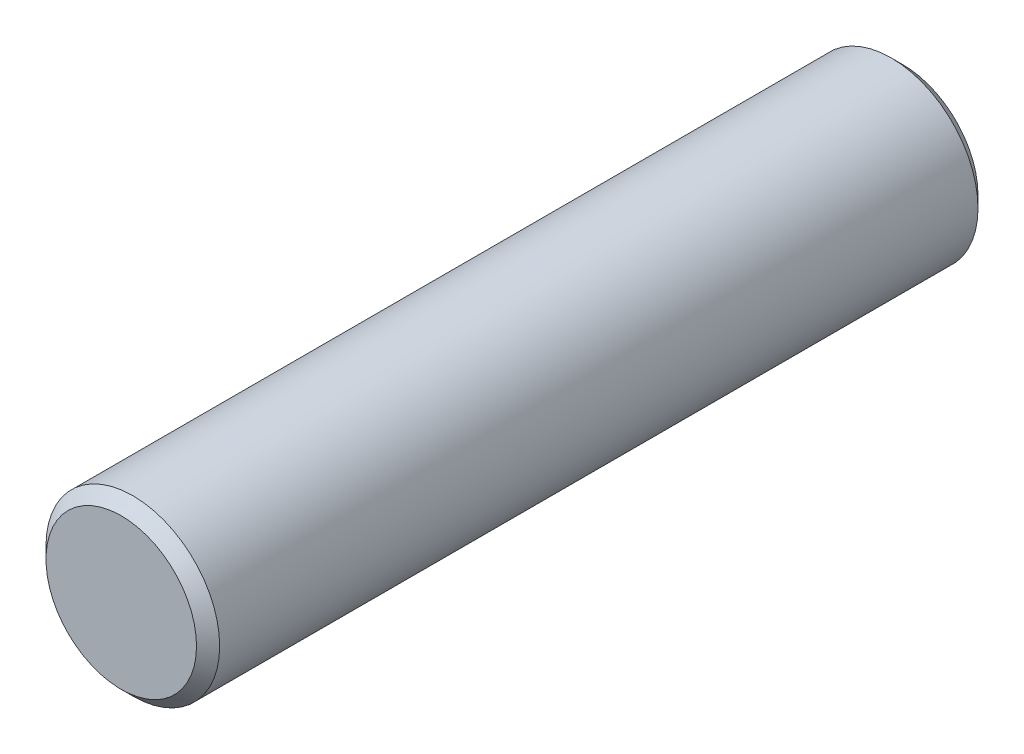
ISO-10303-21;
HEADER;
FILE_DESCRIPTION(('STEP AP214'),'2;1');
FILE_NAME('part.step','',(''),(''),'','','');
FILE_SCHEMA(('AUTOMOTIVE_DESIGN { 1 0 10303 214 1 1 1 1 }'));
ENDSEC;
DATA;
#1=APPLICATION_CONTEXT('core data for automotive mechanical design processes');
#2=APPLICATION_PROTOCOL_DEFINITION('international standard','automotive_design',2000,#1);
#3=PRODUCT_CONTEXT('',#1,'mechanical');
#4=PRODUCT('Part','Part','',(#3));
#5=PRODUCT_RELATED_PRODUCT_CATEGORY('part','',(#4));
#6=PRODUCT_DEFINITION_FORMATION('','',#4);
#7=PRODUCT_DEFINITION_CONTEXT('part definition',#1,'design');
#8=PRODUCT_DEFINITION('design','',#6,#7);
#9=PRODUCT_DEFINITION_SHAPE('','',#8);
#10=(LENGTH_UNIT() NAMED_UNIT(*) SI_UNIT(.MILLI.,.METRE.));
#11=(NAMED_UNIT(*) PLANE_ANGLE_UNIT() SI_UNIT($,.RADIAN.));
#12=(NAMED_UNIT(*) SI_UNIT($,.STERADIAN.) SOLID_ANGLE_UNIT());
#13=UNCERTAINTY_MEASURE_WITH_UNIT(LENGTH_MEASURE(1.E-05),#10,'distance_accuracy_value','');
#14=(GEOMETRIC_REPRESENTATION_CONTEXT(3) GLOBAL_UNCERTAINTY_ASSIGNED_CONTEXT((#13)) GLOBAL_UNIT_ASSIGNED_CONTEXT((#10,
#11,#12)) REPRESENTATION_CONTEXT('',''));
#15=CARTESIAN_POINT('',(0.,0.,0.));
#16=DIRECTION('',(0.,0.,1.));
#17=DIRECTION('',(1.,0.,0.));
#18=AXIS2_PLACEMENT_3D('',#15,#16,#17);
#19=CARTESIAN_POINT('',(0.,0.,13.5));
#20=DIRECTION('',(0.,0.,-1.));
#21=DIRECTION('',(-1.,0.,0.));
#22=AXIS2_PLACEMENT_3D('',#19,#20,#21);
#23=CYLINDRICAL_SURFACE('',#22,1.5);
#24=CARTESIAN_POINT('',(0.,0.,0.199999999999997));
#25=DIRECTION('',(0.,0.,1.));
#26=DIRECTION('',(1.,0.,0.));
#27=AXIS2_PLACEMENT_3D('',#24,#25,#26);
#28=CIRCLE('',#27,1.5);
#29=CARTESIAN_POINT('',(1.5,0.,0.199999999999997));
#30=VERTEX_POINT('',#29);
#31=EDGE_CURVE('E59',#30,#30,#28,.T.);
#32=ORIENTED_EDGE('',*,*,#31,.T.);
#33=EDGE_LOOP('',(#32));
#34=FACE_BOUND('',#33,.T.);
#35=CARTESIAN_POINT('',(0.,0.,13.3));
#36=DIRECTION('',(0.,0.,1.));
#37=DIRECTION('',(1.,0.,0.));
#38=AXIS2_PLACEMENT_3D('',#35,#36,#37);
#39=CIRCLE('',#38,1.5);
#40=CARTESIAN_POINT('',(1.5,0.,13.3));
#41=VERTEX_POINT('',#40);
#42=EDGE_CURVE('E64',#41,#41,#39,.F.);
#43=ORIENTED_EDGE('',*,*,#42,.T.);
#44=EDGE_LOOP('',(#43));
#45=FACE_BOUND('',#44,.T.);
#46=ADVANCED_FACE('F45',(#34,#45),#23,.T.);
#47=CARTESIAN_POINT('',(0.,0.,13.5));
#48=DIRECTION('',(0.,0.,1.));
#49=DIRECTION('',(1.,0.,0.));
#50=AXIS2_PLACEMENT_3D('',#47,#48,#49);
#51=PLANE('',#50);
#52=CARTESIAN_POINT('',(0.,0.,13.5));
#53=DIRECTION('',(0.,0.,1.));
#54=DIRECTION('',(1.,0.,0.));
#55=AXIS2_PLACEMENT_3D('',#52,#53,#54);
#56=CIRCLE('',#55,1.3);
#57=CARTESIAN_POINT('',(1.3,0.,13.5));
#58=VERTEX_POINT('',#57);
#59=EDGE_CURVE('E10',#58,#58,#56,.T.);
#60=ORIENTED_EDGE('',*,*,#59,.T.);
#61=EDGE_LOOP('',(#60));
#62=FACE_BOUND('',#61,.T.);
#63=ADVANCED_FACE('F81',(#62),#51,.T.);
#64=CARTESIAN_POINT('',(0.,0.,0.));
#65=DIRECTION('',(0.,0.,1.));
#66=DIRECTION('',(1.,0.,0.));
#67=AXIS2_PLACEMENT_3D('',#64,#65,#66);
#68=PLANE('',#67);
#69=CARTESIAN_POINT('',(0.,0.,0.));
#70=DIRECTION('',(0.,0.,1.));
#71=DIRECTION('',(1.,0.,0.));
#72=AXIS2_PLACEMENT_3D('',#69,#70,#71);
#73=CIRCLE('',#72,1.3);
#74=CARTESIAN_POINT('',(1.3,0.,0.));
#75=VERTEX_POINT('',#74);
#76=EDGE_CURVE('E54',#75,#75,#73,.F.);
#77=ORIENTED_EDGE('',*,*,#76,.T.);
#78=EDGE_LOOP('',(#77));
#79=FACE_BOUND('',#78,.T.);
#80=ADVANCED_FACE('F78',(#79),#68,.F.);
#81=CARTESIAN_POINT('',(0.,0.,0.199999999999997));
#82=DIRECTION('',(0.,0.,1.));
#83=DIRECTION('',(1.,0.,0.));
#84=AXIS2_PLACEMENT_3D('',#81,#82,#83);
#85=CONICAL_SURFACE('',#84,1.5,0.785398163397454);
#86=ORIENTED_EDGE('',*,*,#76,.F.);
#87=EDGE_LOOP('',(#86));
#88=FACE_BOUND('',#87,.T.);
#89=ORIENTED_EDGE('',*,*,#31,.F.);
#90=EDGE_LOOP('',(#89));
#91=FACE_BOUND('',#90,.T.);
#92=ADVANCED_FACE('F74',(#88,#91),#85,.T.);
#93=CARTESIAN_POINT('',(0.,0.,13.5));
#94=DIRECTION('',(0.,0.,-1.));
#95=DIRECTION('',(-1.,0.,0.));
#96=AXIS2_PLACEMENT_3D('',#93,#94,#95);
#97=CONICAL_SURFACE('',#96,1.3,0.78539816339745);
#98=ORIENTED_EDGE('',*,*,#42,.F.);
#99=EDGE_LOOP('',(#98));
#100=FACE_BOUND('',#99,.T.);
#101=ORIENTED_EDGE('',*,*,#59,.F.);
#102=EDGE_LOOP('',(#101));
#103=FACE_BOUND('',#102,.T.);
#104=ADVANCED_FACE('F48',(#100,#103),#97,.T.);
#105=CLOSED_SHELL('',(#46,#63,#80,#92,#104));
#106=MANIFOLD_SOLID_BREP('B2',#105);
#107=ADVANCED_BREP_SHAPE_REPRESENTATION('',(#18,#106),#14);
#108=SHAPE_DEFINITION_REPRESENTATION(#9,#107);
ENDSEC;
END-ISO-10303-21;
